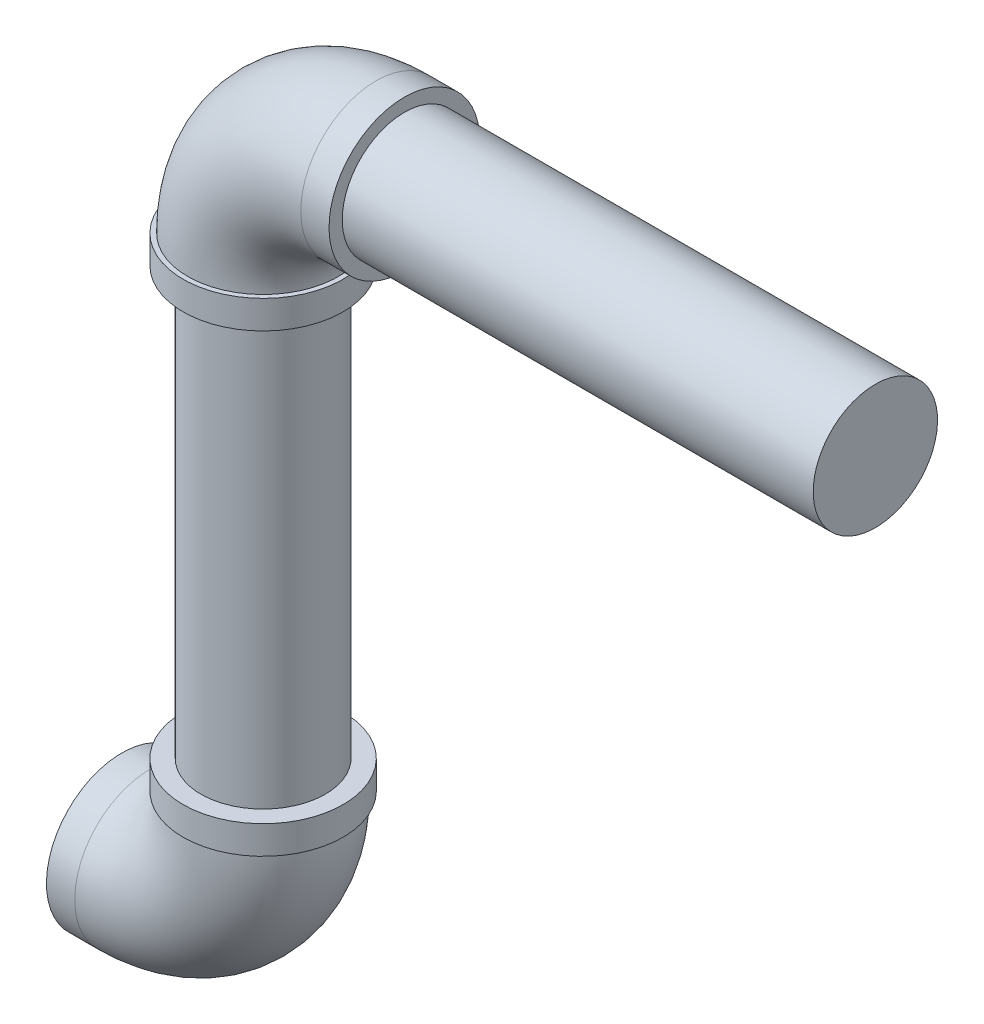
ISO-10303-21;
HEADER;
FILE_DESCRIPTION(('STEP AP214'),'2;1');
FILE_NAME('part.step','',(''),(''),'','','');
FILE_SCHEMA(('AUTOMOTIVE_DESIGN { 1 0 10303 214 1 1 1 1 }'));
ENDSEC;
DATA;
#1=APPLICATION_CONTEXT('core data for automotive mechanical design processes');
#2=APPLICATION_PROTOCOL_DEFINITION('international standard','automotive_design',2000,#1);
#3=PRODUCT_CONTEXT('',#1,'mechanical');
#4=PRODUCT('Part','Part','',(#3));
#5=PRODUCT_RELATED_PRODUCT_CATEGORY('part','',(#4));
#6=PRODUCT_DEFINITION_FORMATION('','',#4);
#7=PRODUCT_DEFINITION_CONTEXT('part definition',#1,'design');
#8=PRODUCT_DEFINITION('design','',#6,#7);
#9=PRODUCT_DEFINITION_SHAPE('','',#8);
#10=(LENGTH_UNIT() NAMED_UNIT(*) SI_UNIT(.MILLI.,.METRE.));
#11=(NAMED_UNIT(*) PLANE_ANGLE_UNIT() SI_UNIT($,.RADIAN.));
#12=(NAMED_UNIT(*) SI_UNIT($,.STERADIAN.) SOLID_ANGLE_UNIT());
#13=UNCERTAINTY_MEASURE_WITH_UNIT(LENGTH_MEASURE(1.E-05),#10,'distance_accuracy_value','');
#14=(GEOMETRIC_REPRESENTATION_CONTEXT(3) GLOBAL_UNCERTAINTY_ASSIGNED_CONTEXT((#13)) GLOBAL_UNIT_ASSIGNED_CONTEXT((#10,
#11,#12)) REPRESENTATION_CONTEXT('',''));
#15=CARTESIAN_POINT('',(0.,0.,0.));
#16=DIRECTION('',(0.,0.,1.));
#17=DIRECTION('',(1.,0.,0.));
#18=AXIS2_PLACEMENT_3D('',#15,#16,#17);
#19=CARTESIAN_POINT('',(0.,57.531,0.));
#20=DIRECTION('',(0.,-1.,0.));
#21=DIRECTION('',(0.,0.,-1.));
#22=AXIS2_PLACEMENT_3D('',#19,#20,#21);
#23=CYLINDRICAL_SURFACE('',#22,16.764);
#24=CARTESIAN_POINT('',(0.,57.531,0.));
#25=DIRECTION('',(0.,1.,0.));
#26=DIRECTION('',(0.,0.,1.));
#27=AXIS2_PLACEMENT_3D('',#24,#25,#26);
#28=CIRCLE('',#27,16.764);
#29=CARTESIAN_POINT('',(0.,57.531,-16.764));
#30=VERTEX_POINT('',#29);
#31=EDGE_CURVE('E84',#30,#30,#28,.T.);
#32=CARTESIAN_POINT('',(0.,-57.531,0.));
#33=DIRECTION('',(0.,1.,0.));
#34=DIRECTION('',(0.,0.,1.));
#35=AXIS2_PLACEMENT_3D('',#32,#33,#34);
#36=CIRCLE('',#35,16.764);
#37=CARTESIAN_POINT('',(0.,-57.531,-16.764));
#38=VERTEX_POINT('',#37);
#39=EDGE_CURVE('E44',#38,#38,#36,.T.);
#40=CARTESIAN_POINT('',(0.,57.531,-16.764));
#41=CARTESIAN_POINT('',(0.,56.3324375,-16.764));
#42=CARTESIAN_POINT('',(0.,55.133875,-16.764));
#43=CARTESIAN_POINT('',(0.,52.73675,-16.764));
#44=CARTESIAN_POINT('',(0.,51.5381875,-16.764));
#45=CARTESIAN_POINT('',(0.,49.1410625,-16.764));
#46=CARTESIAN_POINT('',(0.,47.9425,-16.764));
#47=CARTESIAN_POINT('',(0.,45.545375,-16.764));
#48=CARTESIAN_POINT('',(0.,44.3468125,-16.764));
#49=CARTESIAN_POINT('',(0.,41.9496875,-16.764));
#50=CARTESIAN_POINT('',(0.,40.751125,-16.764));
#51=CARTESIAN_POINT('',(0.,38.354,-16.764));
#52=CARTESIAN_POINT('',(0.,37.1554375,-16.764));
#53=CARTESIAN_POINT('',(0.,34.7583125,-16.764));
#54=CARTESIAN_POINT('',(0.,33.55975,-16.764));
#55=CARTESIAN_POINT('',(0.,31.162625,-16.764));
#56=CARTESIAN_POINT('',(0.,29.9640625,-16.764));
#57=CARTESIAN_POINT('',(0.,27.5669375,-16.764));
#58=CARTESIAN_POINT('',(0.,26.368375,-16.764));
#59=CARTESIAN_POINT('',(0.,23.97125,-16.764));
#60=CARTESIAN_POINT('',(0.,22.7726875,-16.764));
#61=CARTESIAN_POINT('',(0.,20.3755625,-16.764));
#62=CARTESIAN_POINT('',(0.,19.177,-16.764));
#63=CARTESIAN_POINT('',(0.,16.779875,-16.764));
#64=CARTESIAN_POINT('',(0.,15.5813125,-16.764));
#65=CARTESIAN_POINT('',(0.,13.1841875,-16.764));
#66=CARTESIAN_POINT('',(0.,11.985625,-16.764));
#67=CARTESIAN_POINT('',(0.,9.58849999999999,-16.764));
#68=CARTESIAN_POINT('',(0.,8.38993749999999,-16.764));
#69=CARTESIAN_POINT('',(0.,5.99281249999999,-16.764));
#70=CARTESIAN_POINT('',(0.,4.79424999999999,-16.764));
#71=CARTESIAN_POINT('',(0.,2.39712499999999,-16.764));
#72=CARTESIAN_POINT('',(0.,1.19856249999999,-16.764));
#73=CARTESIAN_POINT('',(0.,-1.19856250000001,-16.764));
#74=CARTESIAN_POINT('',(0.,-2.39712500000001,-16.764));
#75=CARTESIAN_POINT('',(0.,-4.79425000000001,-16.764));
#76=CARTESIAN_POINT('',(0.,-5.9928125,-16.764));
#77=CARTESIAN_POINT('',(0.,-8.3899375,-16.764));
#78=CARTESIAN_POINT('',(0.,-9.5885,-16.764));
#79=CARTESIAN_POINT('',(0.,-11.985625,-16.764));
#80=CARTESIAN_POINT('',(0.,-13.1841875,-16.764));
#81=CARTESIAN_POINT('',(0.,-15.5813125,-16.764));
#82=CARTESIAN_POINT('',(0.,-16.779875,-16.764));
#83=CARTESIAN_POINT('',(0.,-19.177,-16.764));
#84=CARTESIAN_POINT('',(0.,-20.3755625,-16.764));
#85=CARTESIAN_POINT('',(0.,-22.7726875,-16.764));
#86=CARTESIAN_POINT('',(0.,-23.97125,-16.764));
#87=CARTESIAN_POINT('',(0.,-26.368375,-16.764));
#88=CARTESIAN_POINT('',(0.,-27.5669375,-16.764));
#89=CARTESIAN_POINT('',(0.,-29.9640625,-16.764));
#90=CARTESIAN_POINT('',(0.,-31.162625,-16.764));
#91=CARTESIAN_POINT('',(0.,-33.55975,-16.764));
#92=CARTESIAN_POINT('',(0.,-34.7583125,-16.764));
#93=CARTESIAN_POINT('',(0.,-37.1554375,-16.764));
#94=CARTESIAN_POINT('',(0.,-38.354,-16.764));
#95=CARTESIAN_POINT('',(0.,-40.751125,-16.764));
#96=CARTESIAN_POINT('',(0.,-41.9496875,-16.764));
#97=CARTESIAN_POINT('',(0.,-44.3468125,-16.764));
#98=CARTESIAN_POINT('',(0.,-45.545375,-16.764));
#99=CARTESIAN_POINT('',(0.,-47.9425,-16.764));
#100=CARTESIAN_POINT('',(0.,-49.1410625,-16.764));
#101=CARTESIAN_POINT('',(0.,-51.5381875,-16.764));
#102=CARTESIAN_POINT('',(0.,-52.73675,-16.764));
#103=CARTESIAN_POINT('',(0.,-55.133875,-16.764));
#104=CARTESIAN_POINT('',(0.,-56.3324375,-16.764));
#105=CARTESIAN_POINT('',(0.,-57.531,-16.764));
#106=B_SPLINE_CURVE_WITH_KNOTS('',3,(#40,#41,#42,#43,#44,#45,#46,#47,#48,#49,#50,#51,#52,#53,
#54,#55,#56,#57,#58,#59,#60,#61,#62,#63,#64,#65,#66,#67,#68,#69,#70,#71,#72,#73,#74,#75,#76,#77,
#78,#79,#80,#81,#82,#83,#84,#85,#86,#87,#88,#89,#90,#91,#92,#93,#94,#95,#96,#97,#98,#99,#100,
#101,#102,#103,#104,#105),.UNSPECIFIED.,.F.,.F.,(4,2,2,2,2,2,2,2,2,2,2,2,2,2,2,2,2,2,2,2,2,2,2,
2,2,2,2,2,2,2,2,2,4),(0.,3.5956875,7.191375,10.7870625,14.38275,17.9784375,21.574125,25.1698125,
28.7655,32.3611875,35.956875,39.5525625,43.14825,46.7439375,50.339625,53.9353125,57.531,
61.1266875,64.722375,68.3180625,71.91375,75.5094375,79.105125,82.7008125,86.2965,89.8921875,
93.487875,97.0835625,100.67925,104.2749375,107.870625,111.4663125,115.062),.UNSPECIFIED.);
#107=EDGE_CURVE('BSEAM41',#30,#38,#106,.T.);
#108=ORIENTED_EDGE('',*,*,#31,.F.);
#109=ORIENTED_EDGE('',*,*,#39,.T.);
#110=ORIENTED_EDGE('',*,*,#107,.T.);
#111=ORIENTED_EDGE('',*,*,#107,.F.);
#112=EDGE_LOOP('',(#108,#110,#109,#111));
#113=FACE_BOUND('',#112,.T.);
#114=ADVANCED_FACE('F41',(#113),#23,.T.);
#115=CARTESIAN_POINT('',(0.,65.151,0.));
#116=DIRECTION('',(0.,-1.,0.));
#117=DIRECTION('',(0.,0.,-1.));
#118=AXIS2_PLACEMENT_3D('',#115,#116,#117);
#119=CYLINDRICAL_SURFACE('',#118,21.59);
#120=CARTESIAN_POINT('',(0.,65.151,0.));
#121=DIRECTION('',(0.,1.,0.));
#122=DIRECTION('',(0.,0.,1.));
#123=AXIS2_PLACEMENT_3D('',#120,#121,#122);
#124=CIRCLE('',#123,21.59);
#125=CARTESIAN_POINT('',(0.,65.151,-21.59));
#126=VERTEX_POINT('',#125);
#127=EDGE_CURVE('E89',#126,#126,#124,.T.);
#128=CARTESIAN_POINT('',(0.,57.531,0.));
#129=DIRECTION('',(0.,1.,0.));
#130=DIRECTION('',(0.,0.,1.));
#131=AXIS2_PLACEMENT_3D('',#128,#129,#130);
#132=CIRCLE('',#131,21.59);
#133=CARTESIAN_POINT('',(0.,57.531,-21.59));
#134=VERTEX_POINT('',#133);
#135=EDGE_CURVE('E88',#134,#134,#132,.T.);
#136=CARTESIAN_POINT('',(0.,65.151,-21.59));
#137=CARTESIAN_POINT('',(0.,65.071625,-21.59));
#138=CARTESIAN_POINT('',(0.,64.99225,-21.59));
#139=CARTESIAN_POINT('',(0.,64.8335,-21.59));
#140=CARTESIAN_POINT('',(0.,64.754125,-21.59));
#141=CARTESIAN_POINT('',(0.,64.595375,-21.59));
#142=CARTESIAN_POINT('',(0.,64.516,-21.59));
#143=CARTESIAN_POINT('',(0.,64.35725,-21.59));
#144=CARTESIAN_POINT('',(0.,64.277875,-21.59));
#145=CARTESIAN_POINT('',(0.,64.119125,-21.59));
#146=CARTESIAN_POINT('',(0.,64.03975,-21.59));
#147=CARTESIAN_POINT('',(0.,63.881,-21.59));
#148=CARTESIAN_POINT('',(0.,63.801625,-21.59));
#149=CARTESIAN_POINT('',(0.,63.642875,-21.59));
#150=CARTESIAN_POINT('',(0.,63.5635,-21.59));
#151=CARTESIAN_POINT('',(0.,63.40475,-21.59));
#152=CARTESIAN_POINT('',(0.,63.325375,-21.59));
#153=CARTESIAN_POINT('',(0.,63.166625,-21.59));
#154=CARTESIAN_POINT('',(0.,63.08725,-21.59));
#155=CARTESIAN_POINT('',(0.,62.9285,-21.59));
#156=CARTESIAN_POINT('',(0.,62.849125,-21.59));
#157=CARTESIAN_POINT('',(0.,62.690375,-21.59));
#158=CARTESIAN_POINT('',(0.,62.611,-21.59));
#159=CARTESIAN_POINT('',(0.,62.45225,-21.59));
#160=CARTESIAN_POINT('',(0.,62.372875,-21.59));
#161=CARTESIAN_POINT('',(0.,62.214125,-21.59));
#162=CARTESIAN_POINT('',(0.,62.13475,-21.59));
#163=CARTESIAN_POINT('',(0.,61.976,-21.59));
#164=CARTESIAN_POINT('',(0.,61.896625,-21.59));
#165=CARTESIAN_POINT('',(0.,61.737875,-21.59));
#166=CARTESIAN_POINT('',(0.,61.6585,-21.59));
#167=CARTESIAN_POINT('',(0.,61.49975,-21.59));
#168=CARTESIAN_POINT('',(0.,61.420375,-21.59));
#169=CARTESIAN_POINT('',(0.,61.261625,-21.59));
#170=CARTESIAN_POINT('',(0.,61.18225,-21.59));
#171=CARTESIAN_POINT('',(0.,61.0235,-21.59));
#172=CARTESIAN_POINT('',(0.,60.944125,-21.59));
#173=CARTESIAN_POINT('',(0.,60.785375,-21.59));
#174=CARTESIAN_POINT('',(0.,60.706,-21.59));
#175=CARTESIAN_POINT('',(0.,60.54725,-21.59));
#176=CARTESIAN_POINT('',(0.,60.467875,-21.59));
#177=CARTESIAN_POINT('',(0.,60.309125,-21.59));
#178=CARTESIAN_POINT('',(0.,60.22975,-21.59));
#179=CARTESIAN_POINT('',(0.,60.071,-21.59));
#180=CARTESIAN_POINT('',(0.,59.991625,-21.59));
#181=CARTESIAN_POINT('',(0.,59.832875,-21.59));
#182=CARTESIAN_POINT('',(0.,59.7535,-21.59));
#183=CARTESIAN_POINT('',(0.,59.59475,-21.59));
#184=CARTESIAN_POINT('',(0.,59.515375,-21.59));
#185=CARTESIAN_POINT('',(0.,59.356625,-21.59));
#186=CARTESIAN_POINT('',(0.,59.27725,-21.59));
#187=CARTESIAN_POINT('',(0.,59.1185,-21.59));
#188=CARTESIAN_POINT('',(0.,59.039125,-21.59));
#189=CARTESIAN_POINT('',(0.,58.880375,-21.59));
#190=CARTESIAN_POINT('',(0.,58.801,-21.59));
#191=CARTESIAN_POINT('',(0.,58.64225,-21.59));
#192=CARTESIAN_POINT('',(0.,58.562875,-21.59));
#193=CARTESIAN_POINT('',(0.,58.404125,-21.59));
#194=CARTESIAN_POINT('',(0.,58.32475,-21.59));
#195=CARTESIAN_POINT('',(0.,58.166,-21.59));
#196=CARTESIAN_POINT('',(0.,58.086625,-21.59));
#197=CARTESIAN_POINT('',(0.,57.927875,-21.59));
#198=CARTESIAN_POINT('',(0.,57.8485,-21.59));
#199=CARTESIAN_POINT('',(0.,57.68975,-21.59));
#200=CARTESIAN_POINT('',(0.,57.610375,-21.59));
#201=CARTESIAN_POINT('',(0.,57.531,-21.59));
#202=B_SPLINE_CURVE_WITH_KNOTS('',3,(#136,#137,#138,#139,#140,#141,#142,#143,#144,#145,#146,
#147,#148,#149,#150,#151,#152,#153,#154,#155,#156,#157,#158,#159,#160,#161,#162,#163,#164,#165,
#166,#167,#168,#169,#170,#171,#172,#173,#174,#175,#176,#177,#178,#179,#180,#181,#182,#183,#184,
#185,#186,#187,#188,#189,#190,#191,#192,#193,#194,#195,#196,#197,#198,#199,#200,#201),
.UNSPECIFIED.,.F.,.F.,(4,2,2,2,2,2,2,2,2,2,2,2,2,2,2,2,2,2,2,2,2,2,2,2,2,2,2,2,2,2,2,2,4),(0.,
0.238125000000006,0.476250000000011,0.714375000000003,0.952500000000009,1.190625,
1.42875000000001,1.66687500000001,1.905,2.14312500000001,2.38125,2.61937500000001,
2.85750000000001,3.095625,3.33375,3.57187500000001,3.81000000000001,4.04812500000001,
4.28625000000001,4.524375,4.7625,5.00062500000001,5.23875000000001,5.47687500000001,
5.71500000000001,5.953125,6.19125000000001,6.42937500000001,6.66750000000001,6.90562500000001,
7.14375,7.38187500000001,7.62000000000001),.UNSPECIFIED.);
#203=EDGE_CURVE('BSEAM104',#126,#134,#202,.T.);
#204=ORIENTED_EDGE('',*,*,#127,.F.);
#205=ORIENTED_EDGE('',*,*,#135,.T.);
#206=ORIENTED_EDGE('',*,*,#203,.T.);
#207=ORIENTED_EDGE('',*,*,#203,.F.);
#208=EDGE_LOOP('',(#204,#206,#205,#207));
#209=FACE_BOUND('',#208,.T.);
#210=ADVANCED_FACE('F104',(#209),#119,.T.);
#211=CARTESIAN_POINT('',(0.,65.151,0.));
#212=DIRECTION('',(0.,1.,0.));
#213=DIRECTION('',(0.,0.,1.));
#214=AXIS2_PLACEMENT_3D('',#211,#212,#213);
#215=PLANE('',#214);
#216=CARTESIAN_POINT('',(0.,65.151,0.));
#217=DIRECTION('',(0.,1.,0.));
#218=DIRECTION('',(0.,0.,1.));
#219=AXIS2_PLACEMENT_3D('',#216,#217,#218);
#220=CIRCLE('',#219,20.32);
#221=CARTESIAN_POINT('',(-20.32,65.151,0.));
#222=VERTEX_POINT('',#221);
#223=EDGE_CURVE('E55',#222,#222,#220,.T.);
#224=ORIENTED_EDGE('',*,*,#223,.F.);
#225=EDGE_LOOP('',(#224));
#226=FACE_BOUND('',#225,.T.);
#227=ORIENTED_EDGE('',*,*,#127,.T.);
#228=EDGE_LOOP('',(#227));
#229=FACE_BOUND('',#228,.T.);
#230=ADVANCED_FACE('F158',(#226,#229),#215,.T.);
#231=CARTESIAN_POINT('',(0.,57.531,0.));
#232=DIRECTION('',(0.,1.,0.));
#233=DIRECTION('',(0.,0.,1.));
#234=AXIS2_PLACEMENT_3D('',#231,#232,#233);
#235=PLANE('',#234);
#236=ORIENTED_EDGE('',*,*,#31,.T.);
#237=EDGE_LOOP('',(#236));
#238=FACE_BOUND('',#237,.T.);
#239=ORIENTED_EDGE('',*,*,#135,.F.);
#240=EDGE_LOOP('',(#239));
#241=FACE_BOUND('',#240,.T.);
#242=ADVANCED_FACE('F99',(#238,#241),#235,.F.);
#243=CARTESIAN_POINT('',(30.48,65.151,0.));
#244=DIRECTION('',(0.,0.,-1.));
#245=DIRECTION('',(-1.,0.,0.));
#246=AXIS2_PLACEMENT_3D('',#243,#244,#245);
#247=TOROIDAL_SURFACE('',#246,30.48,20.32);
#248=CARTESIAN_POINT('',(30.48,95.631,0.));
#249=DIRECTION('',(1.,0.,0.));
#250=DIRECTION('',(0.,0.,1.));
#251=AXIS2_PLACEMENT_3D('',#248,#249,#250);
#252=CIRCLE('',#251,20.32);
#253=CARTESIAN_POINT('',(30.48,115.951,0.));
#254=VERTEX_POINT('',#253);
#255=EDGE_CURVE('E80',#254,#254,#252,.T.);
#256=CARTESIAN_POINT('',(30.48,65.151,0.));
#257=DIRECTION('',(0.,0.,-1.));
#258=DIRECTION('',(-1.,0.,0.));
#259=AXIS2_PLACEMENT_3D('',#256,#257,#258);
#260=CIRCLE('',#259,50.8);
#261=EDGE_CURVE('',#222,#254,#260,.T.);
#262=ORIENTED_EDGE('',*,*,#223,.T.);
#263=ORIENTED_EDGE('',*,*,#255,.F.);
#264=ORIENTED_EDGE('',*,*,#261,.T.);
#265=ORIENTED_EDGE('',*,*,#261,.F.);
#266=EDGE_LOOP('',(#262,#264,#263,#265));
#267=FACE_BOUND('',#266,.T.);
#268=ADVANCED_FACE('F153',(#267),#247,.T.);
#269=CARTESIAN_POINT('',(38.1000000000001,95.631,0.));
#270=DIRECTION('',(-1.,0.,0.));
#271=DIRECTION('',(0.,-1.,0.));
#272=AXIS2_PLACEMENT_3D('',#269,#270,#271);
#273=CYLINDRICAL_SURFACE('',#272,20.32);
#274=CARTESIAN_POINT('',(38.1000000000001,95.631,0.));
#275=DIRECTION('',(1.,0.,0.));
#276=DIRECTION('',(0.,1.,0.));
#277=AXIS2_PLACEMENT_3D('',#274,#275,#276);
#278=CIRCLE('',#277,20.32);
#279=CARTESIAN_POINT('',(38.1000000000001,115.951,0.));
#280=VERTEX_POINT('',#279);
#281=EDGE_CURVE('E76',#280,#280,#278,.T.);
#282=ORIENTED_EDGE('',*,*,#281,.F.);
#283=EDGE_LOOP('',(#282));
#284=FACE_BOUND('',#283,.T.);
#285=ORIENTED_EDGE('',*,*,#255,.T.);
#286=EDGE_LOOP('',(#285));
#287=FACE_BOUND('',#286,.T.);
#288=ADVANCED_FACE('F149',(#284,#287),#273,.T.);
#289=CARTESIAN_POINT('',(38.1000000000001,95.631,0.));
#290=DIRECTION('',(1.,0.,0.));
#291=DIRECTION('',(0.,1.,0.));
#292=AXIS2_PLACEMENT_3D('',#289,#290,#291);
#293=PLANE('',#292);
#294=CARTESIAN_POINT('',(38.1000000000001,95.631,0.));
#295=DIRECTION('',(1.,0.,0.));
#296=DIRECTION('',(0.,1.,0.));
#297=AXIS2_PLACEMENT_3D('',#294,#295,#296);
#298=CIRCLE('',#297,16.764);
#299=CARTESIAN_POINT('',(38.1000000000001,112.395,0.));
#300=VERTEX_POINT('',#299);
#301=EDGE_CURVE('E10',#300,#300,#298,.T.);
#302=ORIENTED_EDGE('',*,*,#301,.F.);
#303=EDGE_LOOP('',(#302));
#304=FACE_BOUND('',#303,.T.);
#305=ORIENTED_EDGE('',*,*,#281,.T.);
#306=EDGE_LOOP('',(#305));
#307=FACE_BOUND('',#306,.T.);
#308=ADVANCED_FACE('F145',(#304,#307),#293,.T.);
#309=CARTESIAN_POINT('',(0.,-65.151,0.));
#310=DIRECTION('',(0.,1.,0.));
#311=DIRECTION('',(0.,0.,1.));
#312=AXIS2_PLACEMENT_3D('',#309,#310,#311);
#313=CYLINDRICAL_SURFACE('',#312,21.59);
#314=CARTESIAN_POINT('',(0.,-65.151,0.));
#315=DIRECTION('',(0.,-1.,0.));
#316=DIRECTION('',(0.,0.,1.));
#317=AXIS2_PLACEMENT_3D('',#314,#315,#316);
#318=CIRCLE('',#317,21.59);
#319=CARTESIAN_POINT('',(0.,-65.151,21.59));
#320=VERTEX_POINT('',#319);
#321=EDGE_CURVE('E69',#320,#320,#318,.T.);
#322=CARTESIAN_POINT('',(0.,-57.531,0.));
#323=DIRECTION('',(0.,-1.,0.));
#324=DIRECTION('',(0.,0.,1.));
#325=AXIS2_PLACEMENT_3D('',#322,#323,#324);
#326=CIRCLE('',#325,21.59);
#327=CARTESIAN_POINT('',(0.,-57.531,21.59));
#328=VERTEX_POINT('',#327);
#329=EDGE_CURVE('E68',#328,#328,#326,.T.);
#330=CARTESIAN_POINT('',(0.,-65.151,21.59));
#331=CARTESIAN_POINT('',(0.,-65.071625,21.59));
#332=CARTESIAN_POINT('',(0.,-64.99225,21.59));
#333=CARTESIAN_POINT('',(0.,-64.8335,21.59));
#334=CARTESIAN_POINT('',(0.,-64.754125,21.59));
#335=CARTESIAN_POINT('',(0.,-64.595375,21.59));
#336=CARTESIAN_POINT('',(0.,-64.516,21.59));
#337=CARTESIAN_POINT('',(0.,-64.35725,21.59));
#338=CARTESIAN_POINT('',(0.,-64.277875,21.59));
#339=CARTESIAN_POINT('',(0.,-64.119125,21.59));
#340=CARTESIAN_POINT('',(0.,-64.03975,21.59));
#341=CARTESIAN_POINT('',(0.,-63.881,21.59));
#342=CARTESIAN_POINT('',(0.,-63.801625,21.59));
#343=CARTESIAN_POINT('',(0.,-63.642875,21.59));
#344=CARTESIAN_POINT('',(0.,-63.5635,21.59));
#345=CARTESIAN_POINT('',(0.,-63.40475,21.59));
#346=CARTESIAN_POINT('',(0.,-63.325375,21.59));
#347=CARTESIAN_POINT('',(0.,-63.166625,21.59));
#348=CARTESIAN_POINT('',(0.,-63.08725,21.59));
#349=CARTESIAN_POINT('',(0.,-62.9285,21.59));
#350=CARTESIAN_POINT('',(0.,-62.849125,21.59));
#351=CARTESIAN_POINT('',(0.,-62.690375,21.59));
#352=CARTESIAN_POINT('',(0.,-62.611,21.59));
#353=CARTESIAN_POINT('',(0.,-62.45225,21.59));
#354=CARTESIAN_POINT('',(0.,-62.372875,21.59));
#355=CARTESIAN_POINT('',(0.,-62.214125,21.59));
#356=CARTESIAN_POINT('',(0.,-62.13475,21.59));
#357=CARTESIAN_POINT('',(0.,-61.976,21.59));
#358=CARTESIAN_POINT('',(0.,-61.896625,21.59));
#359=CARTESIAN_POINT('',(0.,-61.737875,21.59));
#360=CARTESIAN_POINT('',(0.,-61.6585,21.59));
#361=CARTESIAN_POINT('',(0.,-61.49975,21.59));
#362=CARTESIAN_POINT('',(0.,-61.420375,21.59));
#363=CARTESIAN_POINT('',(0.,-61.261625,21.59));
#364=CARTESIAN_POINT('',(0.,-61.18225,21.59));
#365=CARTESIAN_POINT('',(0.,-61.0235,21.59));
#366=CARTESIAN_POINT('',(0.,-60.944125,21.59));
#367=CARTESIAN_POINT('',(0.,-60.785375,21.59));
#368=CARTESIAN_POINT('',(0.,-60.706,21.59));
#369=CARTESIAN_POINT('',(0.,-60.54725,21.59));
#370=CARTESIAN_POINT('',(0.,-60.467875,21.59));
#371=CARTESIAN_POINT('',(0.,-60.309125,21.59));
#372=CARTESIAN_POINT('',(0.,-60.22975,21.59));
#373=CARTESIAN_POINT('',(0.,-60.071,21.59));
#374=CARTESIAN_POINT('',(0.,-59.991625,21.59));
#375=CARTESIAN_POINT('',(0.,-59.832875,21.59));
#376=CARTESIAN_POINT('',(0.,-59.7535,21.59));
#377=CARTESIAN_POINT('',(0.,-59.59475,21.59));
#378=CARTESIAN_POINT('',(0.,-59.515375,21.59));
#379=CARTESIAN_POINT('',(0.,-59.356625,21.59));
#380=CARTESIAN_POINT('',(0.,-59.27725,21.59));
#381=CARTESIAN_POINT('',(0.,-59.1185,21.59));
#382=CARTESIAN_POINT('',(0.,-59.039125,21.59));
#383=CARTESIAN_POINT('',(0.,-58.880375,21.59));
#384=CARTESIAN_POINT('',(0.,-58.801,21.59));
#385=CARTESIAN_POINT('',(0.,-58.64225,21.59));
#386=CARTESIAN_POINT('',(0.,-58.562875,21.59));
#387=CARTESIAN_POINT('',(0.,-58.404125,21.59));
#388=CARTESIAN_POINT('',(0.,-58.32475,21.59));
#389=CARTESIAN_POINT('',(0.,-58.166,21.59));
#390=CARTESIAN_POINT('',(0.,-58.086625,21.59));
#391=CARTESIAN_POINT('',(0.,-57.927875,21.59));
#392=CARTESIAN_POINT('',(0.,-57.8485,21.59));
#393=CARTESIAN_POINT('',(0.,-57.68975,21.59));
#394=CARTESIAN_POINT('',(0.,-57.610375,21.59));
#395=CARTESIAN_POINT('',(0.,-57.531,21.59));
#396=B_SPLINE_CURVE_WITH_KNOTS('',3,(#330,#331,#332,#333,#334,#335,#336,#337,#338,#339,#340,
#341,#342,#343,#344,#345,#346,#347,#348,#349,#350,#351,#352,#353,#354,#355,#356,#357,#358,#359,
#360,#361,#362,#363,#364,#365,#366,#367,#368,#369,#370,#371,#372,#373,#374,#375,#376,#377,#378,
#379,#380,#381,#382,#383,#384,#385,#386,#387,#388,#389,#390,#391,#392,#393,#394,#395),
.UNSPECIFIED.,.F.,.F.,(4,2,2,2,2,2,2,2,2,2,2,2,2,2,2,2,2,2,2,2,2,2,2,2,2,2,2,2,2,2,2,2,4),(0.,
0.238125000000006,0.476250000000011,0.714375000000003,0.952500000000009,1.190625,
1.42875000000001,1.66687500000001,1.905,2.14312500000001,2.38125,2.61937500000001,
2.85750000000001,3.095625,3.33375,3.57187500000001,3.81000000000001,4.04812500000001,
4.28625000000001,4.524375,4.7625,5.00062500000001,5.23875000000001,5.47687500000001,
5.71500000000001,5.953125,6.19125000000001,6.42937500000001,6.66750000000001,6.90562500000001,
7.14375,7.38187500000001,7.62000000000001),.UNSPECIFIED.);
#397=EDGE_CURVE('BSEAM139',#320,#328,#396,.T.);
#398=ORIENTED_EDGE('',*,*,#321,.F.);
#399=ORIENTED_EDGE('',*,*,#329,.T.);
#400=ORIENTED_EDGE('',*,*,#397,.T.);
#401=ORIENTED_EDGE('',*,*,#397,.F.);
#402=EDGE_LOOP('',(#398,#400,#399,#401));
#403=FACE_BOUND('',#402,.T.);
#404=ADVANCED_FACE('F139',(#403),#313,.T.);
#405=CARTESIAN_POINT('',(0.,-65.151,0.));
#406=DIRECTION('',(0.,-1.,0.));
#407=DIRECTION('',(0.,0.,1.));
#408=AXIS2_PLACEMENT_3D('',#405,#406,#407);
#409=PLANE('',#408);
#410=CARTESIAN_POINT('',(0.,-65.151,0.));
#411=DIRECTION('',(0.,-1.,0.));
#412=DIRECTION('',(0.,0.,1.));
#413=AXIS2_PLACEMENT_3D('',#410,#411,#412);
#414=CIRCLE('',#413,20.32);
#415=CARTESIAN_POINT('',(20.32,-65.151,0.));
#416=VERTEX_POINT('',#415);
#417=EDGE_CURVE('E49',#416,#416,#414,.T.);
#418=ORIENTED_EDGE('',*,*,#417,.F.);
#419=EDGE_LOOP('',(#418));
#420=FACE_BOUND('',#419,.T.);
#421=ORIENTED_EDGE('',*,*,#321,.T.);
#422=EDGE_LOOP('',(#421));
#423=FACE_BOUND('',#422,.T.);
#424=ADVANCED_FACE('F136',(#420,#423),#409,.T.);
#425=CARTESIAN_POINT('',(0.,-57.531,0.));
#426=DIRECTION('',(0.,-1.,0.));
#427=DIRECTION('',(0.,0.,1.));
#428=AXIS2_PLACEMENT_3D('',#425,#426,#427);
#429=PLANE('',#428);
#430=ORIENTED_EDGE('',*,*,#39,.F.);
#431=EDGE_LOOP('',(#430));
#432=FACE_BOUND('',#431,.T.);
#433=ORIENTED_EDGE('',*,*,#329,.F.);
#434=EDGE_LOOP('',(#433));
#435=FACE_BOUND('',#434,.T.);
#436=ADVANCED_FACE('F134',(#432,#435),#429,.F.);
#437=CARTESIAN_POINT('',(-30.48,-65.151,0.));
#438=DIRECTION('',(0.,0.,-1.));
#439=DIRECTION('',(-1.,0.,0.));
#440=AXIS2_PLACEMENT_3D('',#437,#438,#439);
#441=TOROIDAL_SURFACE('',#440,30.48,20.32);
#442=CARTESIAN_POINT('',(-30.48,-95.631,0.));
#443=DIRECTION('',(-1.,0.,0.));
#444=DIRECTION('',(0.,0.,1.));
#445=AXIS2_PLACEMENT_3D('',#442,#443,#444);
#446=CIRCLE('',#445,20.32);
#447=CARTESIAN_POINT('',(-30.48,-115.951,0.));
#448=VERTEX_POINT('',#447);
#449=EDGE_CURVE('E63',#448,#448,#446,.T.);
#450=CARTESIAN_POINT('',(-30.48,-65.151,0.));
#451=DIRECTION('',(0.,0.,-1.));
#452=DIRECTION('',(-1.,0.,0.));
#453=AXIS2_PLACEMENT_3D('',#450,#451,#452);
#454=CIRCLE('',#453,50.8);
#455=EDGE_CURVE('',#416,#448,#454,.T.);
#456=ORIENTED_EDGE('',*,*,#417,.T.);
#457=ORIENTED_EDGE('',*,*,#449,.F.);
#458=ORIENTED_EDGE('',*,*,#455,.T.);
#459=ORIENTED_EDGE('',*,*,#455,.F.);
#460=EDGE_LOOP('',(#456,#458,#457,#459));
#461=FACE_BOUND('',#460,.T.);
#462=ADVANCED_FACE('F130',(#461),#441,.T.);
#463=CARTESIAN_POINT('',(-38.1000000000001,-95.631,0.));
#464=DIRECTION('',(1.,0.,0.));
#465=DIRECTION('',(0.,1.,0.));
#466=AXIS2_PLACEMENT_3D('',#463,#464,#465);
#467=CYLINDRICAL_SURFACE('',#466,20.32);
#468=CARTESIAN_POINT('',(-38.1000000000001,-95.631,0.));
#469=DIRECTION('',(-1.,0.,0.));
#470=DIRECTION('',(0.,-1.,0.));
#471=AXIS2_PLACEMENT_3D('',#468,#469,#470);
#472=CIRCLE('',#471,20.32);
#473=CARTESIAN_POINT('',(-38.1000000000001,-115.951,0.));
#474=VERTEX_POINT('',#473);
#475=EDGE_CURVE('E60',#474,#474,#472,.T.);
#476=ORIENTED_EDGE('',*,*,#475,.F.);
#477=EDGE_LOOP('',(#476));
#478=FACE_BOUND('',#477,.T.);
#479=ORIENTED_EDGE('',*,*,#449,.T.);
#480=EDGE_LOOP('',(#479));
#481=FACE_BOUND('',#480,.T.);
#482=ADVANCED_FACE('F124',(#478,#481),#467,.T.);
#483=CARTESIAN_POINT('',(-38.1000000000001,-95.631,0.));
#484=DIRECTION('',(-1.,0.,0.));
#485=DIRECTION('',(0.,-1.,0.));
#486=AXIS2_PLACEMENT_3D('',#483,#484,#485);
#487=PLANE('',#486);
#488=ORIENTED_EDGE('',*,*,#475,.T.);
#489=EDGE_LOOP('',(#488));
#490=FACE_BOUND('',#489,.T.);
#491=ADVANCED_FACE('F117',(#490),#487,.T.);
#492=CARTESIAN_POINT('',(165.1,95.6309999999999,0.));
#493=DIRECTION('',(-1.,0.,0.));
#494=DIRECTION('',(0.,-1.,0.));
#495=AXIS2_PLACEMENT_3D('',#492,#493,#494);
#496=CYLINDRICAL_SURFACE('',#495,16.764);
#497=CARTESIAN_POINT('',(165.1,95.6309999999999,0.));
#498=DIRECTION('',(1.,0.,0.));
#499=DIRECTION('',(0.,1.,0.));
#500=AXIS2_PLACEMENT_3D('',#497,#498,#499);
#501=CIRCLE('',#500,16.764);
#502=CARTESIAN_POINT('',(165.1,112.395,0.));
#503=VERTEX_POINT('',#502);
#504=EDGE_CURVE('E59',#503,#503,#501,.T.);
#505=ORIENTED_EDGE('',*,*,#504,.F.);
#506=EDGE_LOOP('',(#505));
#507=FACE_BOUND('',#506,.T.);
#508=ORIENTED_EDGE('',*,*,#301,.T.);
#509=EDGE_LOOP('',(#508));
#510=FACE_BOUND('',#509,.T.);
#511=ADVANCED_FACE('F115',(#507,#510),#496,.T.);
#512=CARTESIAN_POINT('',(165.1,95.6309999999999,0.));
#513=DIRECTION('',(1.,0.,0.));
#514=DIRECTION('',(0.,1.,0.));
#515=AXIS2_PLACEMENT_3D('',#512,#513,#514);
#516=PLANE('',#515);
#517=ORIENTED_EDGE('',*,*,#504,.T.);
#518=EDGE_LOOP('',(#517));
#519=FACE_BOUND('',#518,.T.);
#520=ADVANCED_FACE('F113',(#519),#516,.T.);
#521=CLOSED_SHELL('',(#114,#210,#230,#242,#268,#288,#308,#404,#424,#436,#462,#482,#491,#511,#520));
#522=MANIFOLD_SOLID_BREP('B2',#521);
#523=ADVANCED_BREP_SHAPE_REPRESENTATION('',(#18,#522),#14);
#524=SHAPE_DEFINITION_REPRESENTATION(#9,#523);
ENDSEC;
END-ISO-10303-21;
